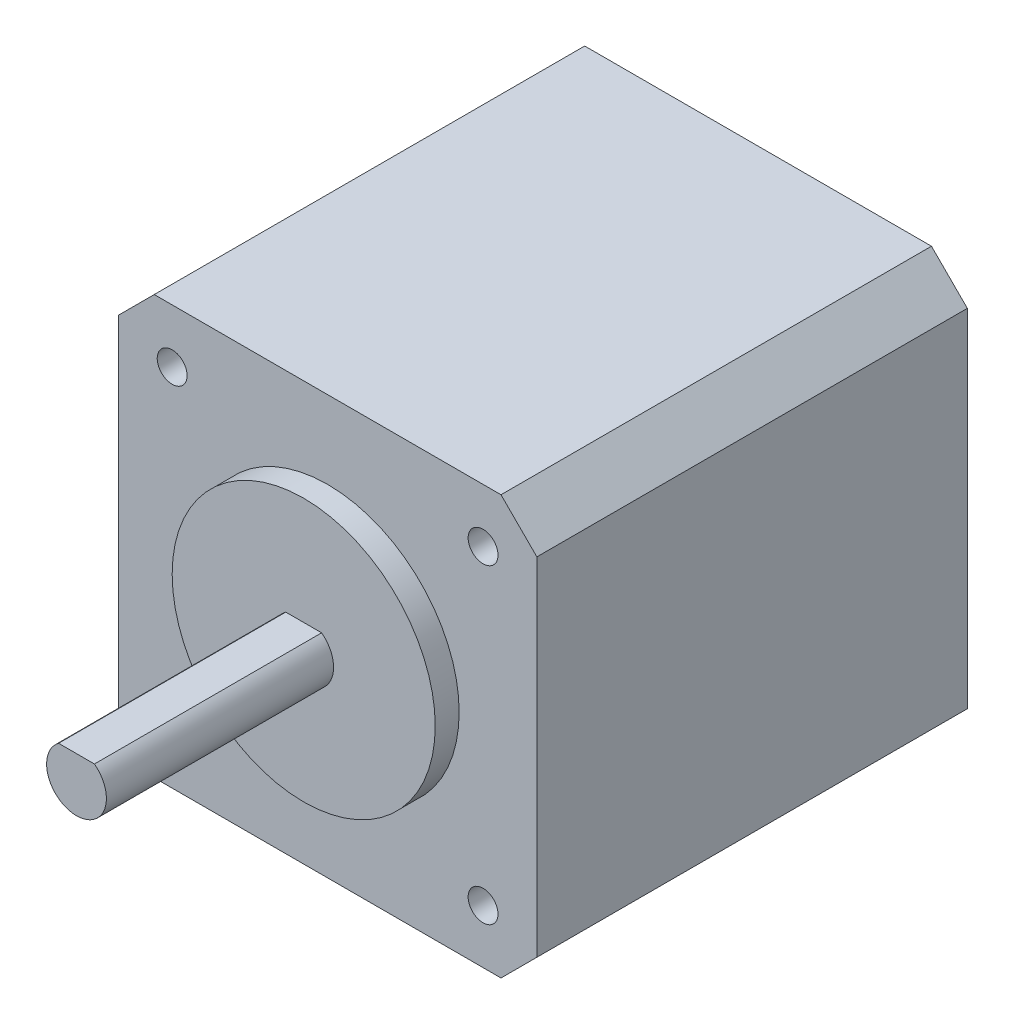
ISO-10303-21;
HEADER;
FILE_DESCRIPTION(('STEP AP214'),'2;1');
FILE_NAME('part.step','',(''),(''),'','','');
FILE_SCHEMA(('AUTOMOTIVE_DESIGN { 1 0 10303 214 1 1 1 1 }'));
ENDSEC;
DATA;
#1=APPLICATION_CONTEXT('core data for automotive mechanical design processes');
#2=APPLICATION_PROTOCOL_DEFINITION('international standard','automotive_design',2000,#1);
#3=PRODUCT_CONTEXT('',#1,'mechanical');
#4=PRODUCT('Part','Part','',(#3));
#5=PRODUCT_RELATED_PRODUCT_CATEGORY('part','',(#4));
#6=PRODUCT_DEFINITION_FORMATION('','',#4);
#7=PRODUCT_DEFINITION_CONTEXT('part definition',#1,'design');
#8=PRODUCT_DEFINITION('design','',#6,#7);
#9=PRODUCT_DEFINITION_SHAPE('','',#8);
#10=(LENGTH_UNIT() NAMED_UNIT(*) SI_UNIT(.MILLI.,.METRE.));
#11=(NAMED_UNIT(*) PLANE_ANGLE_UNIT() SI_UNIT($,.RADIAN.));
#12=(NAMED_UNIT(*) SI_UNIT($,.STERADIAN.) SOLID_ANGLE_UNIT());
#13=UNCERTAINTY_MEASURE_WITH_UNIT(LENGTH_MEASURE(1.E-05),#10,'distance_accuracy_value','');
#14=(GEOMETRIC_REPRESENTATION_CONTEXT(3) GLOBAL_UNCERTAINTY_ASSIGNED_CONTEXT((#13)) GLOBAL_UNIT_ASSIGNED_CONTEXT((#10,
#11,#12)) REPRESENTATION_CONTEXT('',''));
#15=CARTESIAN_POINT('',(0.,0.,0.));
#16=DIRECTION('',(0.,0.,1.));
#17=DIRECTION('',(1.,0.,0.));
#18=AXIS2_PLACEMENT_3D('',#15,#16,#17);
#19=CARTESIAN_POINT('',(0.,0.,0.));
#20=DIRECTION('',(0.,0.,1.));
#21=DIRECTION('',(1.,0.,0.));
#22=AXIS2_PLACEMENT_3D('',#19,#20,#21);
#23=PLANE('',#22);
#24=CARTESIAN_POINT('',(13.,13.,0.));
#25=DIRECTION('',(0.,0.,1.));
#26=DIRECTION('',(1.,0.,0.));
#27=AXIS2_PLACEMENT_3D('',#24,#25,#26);
#28=CIRCLE('',#27,1.25);
#29=CARTESIAN_POINT('',(14.25,13.,0.));
#30=VERTEX_POINT('',#29);
#31=EDGE_CURVE('E203',#30,#30,#28,.T.);
#32=ORIENTED_EDGE('',*,*,#31,.F.);
#33=EDGE_LOOP('',(#32));
#34=FACE_BOUND('',#33,.T.);
#35=CARTESIAN_POINT('',(-13.,13.,0.));
#36=DIRECTION('',(0.,0.,1.));
#37=DIRECTION('',(1.,0.,0.));
#38=AXIS2_PLACEMENT_3D('',#35,#36,#37);
#39=CIRCLE('',#38,1.25);
#40=CARTESIAN_POINT('',(-11.75,13.,0.));
#41=VERTEX_POINT('',#40);
#42=EDGE_CURVE('E214',#41,#41,#39,.T.);
#43=ORIENTED_EDGE('',*,*,#42,.F.);
#44=EDGE_LOOP('',(#43));
#45=FACE_BOUND('',#44,.T.);
#46=CARTESIAN_POINT('',(-13.,-13.,0.));
#47=DIRECTION('',(0.,0.,1.));
#48=DIRECTION('',(1.,0.,0.));
#49=AXIS2_PLACEMENT_3D('',#46,#47,#48);
#50=CIRCLE('',#49,1.25);
#51=CARTESIAN_POINT('',(-11.75,-13.,0.));
#52=VERTEX_POINT('',#51);
#53=EDGE_CURVE('E220',#52,#52,#50,.T.);
#54=ORIENTED_EDGE('',*,*,#53,.F.);
#55=EDGE_LOOP('',(#54));
#56=FACE_BOUND('',#55,.T.);
#57=CARTESIAN_POINT('',(13.,-13.,0.));
#58=DIRECTION('',(0.,0.,1.));
#59=DIRECTION('',(1.,0.,0.));
#60=AXIS2_PLACEMENT_3D('',#57,#58,#59);
#61=CIRCLE('',#60,1.25);
#62=CARTESIAN_POINT('',(14.25,-13.,0.));
#63=VERTEX_POINT('',#62);
#64=EDGE_CURVE('E226',#63,#63,#61,.T.);
#65=ORIENTED_EDGE('',*,*,#64,.F.);
#66=EDGE_LOOP('',(#65));
#67=FACE_BOUND('',#66,.T.);
#68=DIRECTION('',(-0.707106781186548,0.707106781186547,0.));
#69=VECTOR('',#68,1.);
#70=CARTESIAN_POINT('',(17.5,14.5,0.));
#71=LINE('',#70,#69);
#72=CARTESIAN_POINT('',(17.5,14.5,0.));
#73=VERTEX_POINT('',#72);
#74=CARTESIAN_POINT('',(14.5,17.5,0.));
#75=VERTEX_POINT('',#74);
#76=EDGE_CURVE('E151',#73,#75,#71,.T.);
#77=ORIENTED_EDGE('',*,*,#76,.T.);
#78=DIRECTION('',(-1.,0.,0.));
#79=VECTOR('',#78,1.);
#80=CARTESIAN_POINT('',(14.5,17.5,0.));
#81=LINE('',#80,#79);
#82=CARTESIAN_POINT('',(-14.5,17.5,0.));
#83=VERTEX_POINT('',#82);
#84=EDGE_CURVE('E154',#75,#83,#81,.T.);
#85=ORIENTED_EDGE('',*,*,#84,.T.);
#86=DIRECTION('',(-0.707106781186547,-0.707106781186548,0.));
#87=VECTOR('',#86,1.);
#88=CARTESIAN_POINT('',(-14.5,17.5,0.));
#89=LINE('',#88,#87);
#90=CARTESIAN_POINT('',(-17.5,14.5,0.));
#91=VERTEX_POINT('',#90);
#92=EDGE_CURVE('E158',#83,#91,#89,.T.);
#93=ORIENTED_EDGE('',*,*,#92,.T.);
#94=DIRECTION('',(0.,1.,0.));
#95=VECTOR('',#94,1.);
#96=CARTESIAN_POINT('',(-17.5,-14.5,0.));
#97=LINE('',#96,#95);
#98=CARTESIAN_POINT('',(-17.5,-14.5,0.));
#99=VERTEX_POINT('',#98);
#100=EDGE_CURVE('E161',#99,#91,#97,.T.);
#101=ORIENTED_EDGE('',*,*,#100,.F.);
#102=DIRECTION('',(-0.707106781186548,0.707106781186547,0.));
#103=VECTOR('',#102,1.);
#104=CARTESIAN_POINT('',(-14.5,-17.5,0.));
#105=LINE('',#104,#103);
#106=CARTESIAN_POINT('',(-14.5,-17.5,0.));
#107=VERTEX_POINT('',#106);
#108=EDGE_CURVE('E164',#107,#99,#105,.T.);
#109=ORIENTED_EDGE('',*,*,#108,.F.);
#110=DIRECTION('',(-1.,0.,0.));
#111=VECTOR('',#110,1.);
#112=CARTESIAN_POINT('',(14.5,-17.5,0.));
#113=LINE('',#112,#111);
#114=CARTESIAN_POINT('',(14.5,-17.5,0.));
#115=VERTEX_POINT('',#114);
#116=EDGE_CURVE('E166',#115,#107,#113,.T.);
#117=ORIENTED_EDGE('',*,*,#116,.F.);
#118=DIRECTION('',(-0.707106781186548,-0.707106781186547,0.));
#119=VECTOR('',#118,1.);
#120=CARTESIAN_POINT('',(17.5,-14.5,0.));
#121=LINE('',#120,#119);
#122=CARTESIAN_POINT('',(17.5,-14.5,0.));
#123=VERTEX_POINT('',#122);
#124=EDGE_CURVE('E135',#123,#115,#121,.T.);
#125=ORIENTED_EDGE('',*,*,#124,.F.);
#126=DIRECTION('',(0.,1.,0.));
#127=VECTOR('',#126,1.);
#128=CARTESIAN_POINT('',(17.5,-14.5,0.));
#129=LINE('',#128,#127);
#130=EDGE_CURVE('E169',#123,#73,#129,.T.);
#131=ORIENTED_EDGE('',*,*,#130,.T.);
#132=EDGE_LOOP('',(#77,#85,#93,#101,#109,#117,#125,#131));
#133=FACE_BOUND('',#132,.T.);
#134=CARTESIAN_POINT('',(0.,0.,0.));
#135=DIRECTION('',(0.,0.,1.));
#136=DIRECTION('',(1.,0.,0.));
#137=AXIS2_PLACEMENT_3D('',#134,#135,#136);
#138=CIRCLE('',#137,11.);
#139=CARTESIAN_POINT('',(11.,0.,0.));
#140=VERTEX_POINT('',#139);
#141=EDGE_CURVE('E232',#140,#140,#138,.T.);
#142=ORIENTED_EDGE('',*,*,#141,.F.);
#143=EDGE_LOOP('',(#142));
#144=FACE_BOUND('',#143,.T.);
#145=ADVANCED_FACE('F41',(#34,#45,#56,#67,#133,#144),#23,.T.);
#146=CARTESIAN_POINT('',(17.5,14.5,-36.));
#147=DIRECTION('',(0.707106781186547,0.707106781186548,0.));
#148=DIRECTION('',(-0.707106781186548,0.707106781186547,0.));
#149=AXIS2_PLACEMENT_3D('',#146,#147,#148);
#150=PLANE('',#149);
#151=ORIENTED_EDGE('',*,*,#76,.F.);
#152=DIRECTION('',(0.,0.,1.));
#153=VECTOR('',#152,1.);
#154=CARTESIAN_POINT('',(17.5,14.5,-36.));
#155=LINE('',#154,#153);
#156=CARTESIAN_POINT('',(17.5,14.5,-36.));
#157=VERTEX_POINT('',#156);
#158=EDGE_CURVE('E64',#157,#73,#155,.T.);
#159=ORIENTED_EDGE('',*,*,#158,.F.);
#160=DIRECTION('',(-0.707106781186548,0.707106781186547,0.));
#161=VECTOR('',#160,1.);
#162=CARTESIAN_POINT('',(17.5,14.5,-36.));
#163=LINE('',#162,#161);
#164=CARTESIAN_POINT('',(14.5,17.5,-36.));
#165=VERTEX_POINT('',#164);
#166=EDGE_CURVE('E172',#157,#165,#163,.T.);
#167=ORIENTED_EDGE('',*,*,#166,.T.);
#168=DIRECTION('',(0.,0.,1.));
#169=VECTOR('',#168,1.);
#170=CARTESIAN_POINT('',(14.5,17.5,-36.));
#171=LINE('',#170,#169);
#172=EDGE_CURVE('E103',#165,#75,#171,.T.);
#173=ORIENTED_EDGE('',*,*,#172,.T.);
#174=EDGE_LOOP('',(#151,#159,#167,#173));
#175=FACE_BOUND('',#174,.T.);
#176=ADVANCED_FACE('F43',(#175),#150,.T.);
#177=CARTESIAN_POINT('',(17.5,-14.5,-36.));
#178=DIRECTION('',(1.,0.,0.));
#179=DIRECTION('',(0.,0.,-1.));
#180=AXIS2_PLACEMENT_3D('',#177,#178,#179);
#181=PLANE('',#180);
#182=ORIENTED_EDGE('',*,*,#130,.F.);
#183=DIRECTION('',(0.,0.,1.));
#184=VECTOR('',#183,1.);
#185=CARTESIAN_POINT('',(17.5,-14.5,-36.));
#186=LINE('',#185,#184);
#187=CARTESIAN_POINT('',(17.5,-14.5,-36.));
#188=VERTEX_POINT('',#187);
#189=EDGE_CURVE('E138',#188,#123,#186,.T.);
#190=ORIENTED_EDGE('',*,*,#189,.F.);
#191=DIRECTION('',(0.,1.,0.));
#192=VECTOR('',#191,1.);
#193=CARTESIAN_POINT('',(17.5,-14.5,-36.));
#194=LINE('',#193,#192);
#195=EDGE_CURVE('E128',#188,#157,#194,.T.);
#196=ORIENTED_EDGE('',*,*,#195,.T.);
#197=ORIENTED_EDGE('',*,*,#158,.T.);
#198=EDGE_LOOP('',(#182,#190,#196,#197));
#199=FACE_BOUND('',#198,.T.);
#200=ADVANCED_FACE('F255',(#199),#181,.T.);
#201=CARTESIAN_POINT('',(17.5,-14.5,-36.));
#202=DIRECTION('',(-0.707106781186547,0.707106781186548,0.));
#203=DIRECTION('',(-0.707106781186548,-0.707106781186547,0.));
#204=AXIS2_PLACEMENT_3D('',#201,#202,#203);
#205=PLANE('',#204);
#206=ORIENTED_EDGE('',*,*,#124,.T.);
#207=DIRECTION('',(0.,0.,1.));
#208=VECTOR('',#207,1.);
#209=CARTESIAN_POINT('',(14.5,-17.5,-36.));
#210=LINE('',#209,#208);
#211=CARTESIAN_POINT('',(14.5,-17.5,-36.));
#212=VERTEX_POINT('',#211);
#213=EDGE_CURVE('E132',#212,#115,#210,.T.);
#214=ORIENTED_EDGE('',*,*,#213,.F.);
#215=DIRECTION('',(-0.707106781186548,-0.707106781186547,0.));
#216=VECTOR('',#215,1.);
#217=CARTESIAN_POINT('',(17.5,-14.5,-36.));
#218=LINE('',#217,#216);
#219=EDGE_CURVE('E122',#188,#212,#218,.T.);
#220=ORIENTED_EDGE('',*,*,#219,.F.);
#221=ORIENTED_EDGE('',*,*,#189,.T.);
#222=EDGE_LOOP('',(#206,#214,#220,#221));
#223=FACE_BOUND('',#222,.T.);
#224=ADVANCED_FACE('F133',(#223),#205,.F.);
#225=CARTESIAN_POINT('',(14.5,-17.5,-36.));
#226=DIRECTION('',(0.,1.,0.));
#227=DIRECTION('',(-1.,0.,0.));
#228=AXIS2_PLACEMENT_3D('',#225,#226,#227);
#229=PLANE('',#228);
#230=ORIENTED_EDGE('',*,*,#116,.T.);
#231=DIRECTION('',(0.,0.,1.));
#232=VECTOR('',#231,1.);
#233=CARTESIAN_POINT('',(-14.5,-17.5,-36.));
#234=LINE('',#233,#232);
#235=CARTESIAN_POINT('',(-14.5,-17.5,-36.));
#236=VERTEX_POINT('',#235);
#237=EDGE_CURVE('E139',#236,#107,#234,.T.);
#238=ORIENTED_EDGE('',*,*,#237,.F.);
#239=DIRECTION('',(-1.,0.,0.));
#240=VECTOR('',#239,1.);
#241=CARTESIAN_POINT('',(14.5,-17.5,-36.));
#242=LINE('',#241,#240);
#243=EDGE_CURVE('E126',#212,#236,#242,.T.);
#244=ORIENTED_EDGE('',*,*,#243,.F.);
#245=ORIENTED_EDGE('',*,*,#213,.T.);
#246=EDGE_LOOP('',(#230,#238,#244,#245));
#247=FACE_BOUND('',#246,.T.);
#248=ADVANCED_FACE('F141',(#247),#229,.F.);
#249=CARTESIAN_POINT('',(-14.5,-17.5,-36.));
#250=DIRECTION('',(0.707106781186547,0.707106781186548,0.));
#251=DIRECTION('',(-0.707106781186548,0.707106781186547,0.));
#252=AXIS2_PLACEMENT_3D('',#249,#250,#251);
#253=PLANE('',#252);
#254=ORIENTED_EDGE('',*,*,#108,.T.);
#255=DIRECTION('',(0.,0.,1.));
#256=VECTOR('',#255,1.);
#257=CARTESIAN_POINT('',(-17.5,-14.5,-36.));
#258=LINE('',#257,#256);
#259=CARTESIAN_POINT('',(-17.5,-14.5,-36.));
#260=VERTEX_POINT('',#259);
#261=EDGE_CURVE('E176',#260,#99,#258,.T.);
#262=ORIENTED_EDGE('',*,*,#261,.F.);
#263=DIRECTION('',(-0.707106781186548,0.707106781186547,0.));
#264=VECTOR('',#263,1.);
#265=CARTESIAN_POINT('',(-14.5,-17.5,-36.));
#266=LINE('',#265,#264);
#267=EDGE_CURVE('E144',#236,#260,#266,.T.);
#268=ORIENTED_EDGE('',*,*,#267,.F.);
#269=ORIENTED_EDGE('',*,*,#237,.T.);
#270=EDGE_LOOP('',(#254,#262,#268,#269));
#271=FACE_BOUND('',#270,.T.);
#272=ADVANCED_FACE('F421',(#271),#253,.F.);
#273=CARTESIAN_POINT('',(-17.5,-14.5,-36.));
#274=DIRECTION('',(1.,0.,0.));
#275=DIRECTION('',(0.,1.,0.));
#276=AXIS2_PLACEMENT_3D('',#273,#274,#275);
#277=PLANE('',#276);
#278=ORIENTED_EDGE('',*,*,#100,.T.);
#279=DIRECTION('',(0.,0.,1.));
#280=VECTOR('',#279,1.);
#281=CARTESIAN_POINT('',(-17.5,14.5,-36.));
#282=LINE('',#281,#280);
#283=CARTESIAN_POINT('',(-17.5,14.5,-36.));
#284=VERTEX_POINT('',#283);
#285=EDGE_CURVE('E179',#284,#91,#282,.T.);
#286=ORIENTED_EDGE('',*,*,#285,.F.);
#287=DIRECTION('',(0.,1.,0.));
#288=VECTOR('',#287,1.);
#289=CARTESIAN_POINT('',(-17.5,-14.5,-36.));
#290=LINE('',#289,#288);
#291=EDGE_CURVE('E146',#260,#284,#290,.T.);
#292=ORIENTED_EDGE('',*,*,#291,.F.);
#293=ORIENTED_EDGE('',*,*,#261,.T.);
#294=EDGE_LOOP('',(#278,#286,#292,#293));
#295=FACE_BOUND('',#294,.T.);
#296=ADVANCED_FACE('F247',(#295),#277,.F.);
#297=CARTESIAN_POINT('',(-14.5,17.5,-36.));
#298=DIRECTION('',(-0.707106781186548,0.707106781186547,0.));
#299=DIRECTION('',(-0.707106781186547,-0.707106781186548,0.));
#300=AXIS2_PLACEMENT_3D('',#297,#298,#299);
#301=PLANE('',#300);
#302=ORIENTED_EDGE('',*,*,#92,.F.);
#303=DIRECTION('',(0.,0.,1.));
#304=VECTOR('',#303,1.);
#305=CARTESIAN_POINT('',(-14.5,17.5,-36.));
#306=LINE('',#305,#304);
#307=CARTESIAN_POINT('',(-14.5,17.5,-36.));
#308=VERTEX_POINT('',#307);
#309=EDGE_CURVE('E181',#308,#83,#306,.T.);
#310=ORIENTED_EDGE('',*,*,#309,.F.);
#311=DIRECTION('',(-0.707106781186547,-0.707106781186548,0.));
#312=VECTOR('',#311,1.);
#313=CARTESIAN_POINT('',(-14.5,17.5,-36.));
#314=LINE('',#313,#312);
#315=EDGE_CURVE('E240',#308,#284,#314,.T.);
#316=ORIENTED_EDGE('',*,*,#315,.T.);
#317=ORIENTED_EDGE('',*,*,#285,.T.);
#318=EDGE_LOOP('',(#302,#310,#316,#317));
#319=FACE_BOUND('',#318,.T.);
#320=ADVANCED_FACE('F251',(#319),#301,.T.);
#321=CARTESIAN_POINT('',(14.5,17.5,-36.));
#322=DIRECTION('',(0.,1.,0.));
#323=DIRECTION('',(-1.,0.,0.));
#324=AXIS2_PLACEMENT_3D('',#321,#322,#323);
#325=PLANE('',#324);
#326=ORIENTED_EDGE('',*,*,#84,.F.);
#327=ORIENTED_EDGE('',*,*,#172,.F.);
#328=DIRECTION('',(-1.,0.,0.));
#329=VECTOR('',#328,1.);
#330=CARTESIAN_POINT('',(14.5,17.5,-36.));
#331=LINE('',#330,#329);
#332=EDGE_CURVE('E238',#165,#308,#331,.T.);
#333=ORIENTED_EDGE('',*,*,#332,.T.);
#334=ORIENTED_EDGE('',*,*,#309,.T.);
#335=EDGE_LOOP('',(#326,#327,#333,#334));
#336=FACE_BOUND('',#335,.T.);
#337=ADVANCED_FACE('F252',(#336),#325,.T.);
#338=CARTESIAN_POINT('',(0.,0.,-36.));
#339=DIRECTION('',(0.,0.,1.));
#340=DIRECTION('',(1.,0.,0.));
#341=AXIS2_PLACEMENT_3D('',#338,#339,#340);
#342=PLANE('',#341);
#343=ORIENTED_EDGE('',*,*,#166,.F.);
#344=ORIENTED_EDGE('',*,*,#195,.F.);
#345=ORIENTED_EDGE('',*,*,#219,.T.);
#346=ORIENTED_EDGE('',*,*,#243,.T.);
#347=ORIENTED_EDGE('',*,*,#267,.T.);
#348=ORIENTED_EDGE('',*,*,#291,.T.);
#349=ORIENTED_EDGE('',*,*,#315,.F.);
#350=ORIENTED_EDGE('',*,*,#332,.F.);
#351=EDGE_LOOP('',(#343,#344,#345,#346,#347,#348,#349,#350));
#352=FACE_BOUND('',#351,.T.);
#353=ADVANCED_FACE('F124',(#352),#342,.F.);
#354=CARTESIAN_POINT('',(0.,0.,2.));
#355=DIRECTION('',(0.,0.,-1.));
#356=DIRECTION('',(-1.,0.,0.));
#357=AXIS2_PLACEMENT_3D('',#354,#355,#356);
#358=CYLINDRICAL_SURFACE('',#357,11.);
#359=CARTESIAN_POINT('',(0.,0.,2.));
#360=DIRECTION('',(0.,0.,1.));
#361=DIRECTION('',(1.,0.,0.));
#362=AXIS2_PLACEMENT_3D('',#359,#360,#361);
#363=CIRCLE('',#362,11.);
#364=CARTESIAN_POINT('',(11.,0.,2.));
#365=VERTEX_POINT('',#364);
#366=EDGE_CURVE('E155',#365,#365,#363,.T.);
#367=ORIENTED_EDGE('',*,*,#366,.F.);
#368=EDGE_LOOP('',(#367));
#369=FACE_BOUND('',#368,.T.);
#370=ORIENTED_EDGE('',*,*,#141,.T.);
#371=EDGE_LOOP('',(#370));
#372=FACE_BOUND('',#371,.T.);
#373=ADVANCED_FACE('F273',(#369,#372),#358,.T.);
#374=CARTESIAN_POINT('',(0.,0.,2.));
#375=DIRECTION('',(0.,0.,1.));
#376=DIRECTION('',(1.,0.,0.));
#377=AXIS2_PLACEMENT_3D('',#374,#375,#376);
#378=PLANE('',#377);
#379=DIRECTION('',(-1.,0.,0.));
#380=VECTOR('',#379,1.);
#381=CARTESIAN_POINT('',(0.,2.00000000000001,2.));
#382=LINE('',#381,#380);
#383=CARTESIAN_POINT('',(1.5,2.00000000000001,2.00000000000001));
#384=VERTEX_POINT('',#383);
#385=CARTESIAN_POINT('',(-1.5,2.00000000000001,2.));
#386=VERTEX_POINT('',#385);
#387=EDGE_CURVE('E11',#384,#386,#382,.T.);
#388=ORIENTED_EDGE('',*,*,#387,.F.);
#389=CARTESIAN_POINT('',(0.,0.,2.));
#390=DIRECTION('',(0.,0.,1.));
#391=DIRECTION('',(1.,0.,0.));
#392=AXIS2_PLACEMENT_3D('',#389,#390,#391);
#393=CIRCLE('',#392,2.5);
#394=EDGE_CURVE('E49',#384,#386,#393,.F.);
#395=ORIENTED_EDGE('',*,*,#394,.T.);
#396=EDGE_LOOP('',(#388,#395));
#397=FACE_BOUND('',#396,.T.);
#398=ORIENTED_EDGE('',*,*,#366,.T.);
#399=EDGE_LOOP('',(#398));
#400=FACE_BOUND('',#399,.T.);
#401=ADVANCED_FACE('F186',(#397,#400),#378,.T.);
#402=CARTESIAN_POINT('',(13.,-13.,-5.));
#403=DIRECTION('',(0.,0.,1.));
#404=DIRECTION('',(1.,0.,0.));
#405=AXIS2_PLACEMENT_3D('',#402,#403,#404);
#406=CONICAL_SURFACE('',#405,1.25,1.02974425867665);
#407=CARTESIAN_POINT('',(13.,-13.,-5.75107577378445));
#408=VERTEX_POINT('',#407);
#409=VERTEX_LOOP('',#408);
#410=FACE_BOUND('',#409,.T.);
#411=CARTESIAN_POINT('',(13.,-13.,-5.));
#412=DIRECTION('',(0.,0.,1.));
#413=DIRECTION('',(1.,0.,0.));
#414=AXIS2_PLACEMENT_3D('',#411,#412,#413);
#415=CIRCLE('',#414,1.25);
#416=CARTESIAN_POINT('',(14.25,-13.,-5.));
#417=VERTEX_POINT('',#416);
#418=EDGE_CURVE('E229',#417,#417,#415,.T.);
#419=ORIENTED_EDGE('',*,*,#418,.T.);
#420=EDGE_LOOP('',(#419));
#421=FACE_BOUND('',#420,.T.);
#422=ADVANCED_FACE('F279',(#410,#421),#406,.F.);
#423=CARTESIAN_POINT('',(13.,-13.,0.));
#424=DIRECTION('',(0.,0.,1.));
#425=DIRECTION('',(1.,0.,0.));
#426=AXIS2_PLACEMENT_3D('',#423,#424,#425);
#427=CYLINDRICAL_SURFACE('',#426,1.25);
#428=ORIENTED_EDGE('',*,*,#418,.F.);
#429=EDGE_LOOP('',(#428));
#430=FACE_BOUND('',#429,.T.);
#431=ORIENTED_EDGE('',*,*,#64,.T.);
#432=EDGE_LOOP('',(#431));
#433=FACE_BOUND('',#432,.T.);
#434=ADVANCED_FACE('F282',(#430,#433),#427,.F.);
#435=CARTESIAN_POINT('',(-13.,-13.,-5.));
#436=DIRECTION('',(0.,0.,1.));
#437=DIRECTION('',(1.,0.,0.));
#438=AXIS2_PLACEMENT_3D('',#435,#436,#437);
#439=CONICAL_SURFACE('',#438,1.25,1.02974425867665);
#440=CARTESIAN_POINT('',(-13.,-13.,-5.75107577378445));
#441=VERTEX_POINT('',#440);
#442=VERTEX_LOOP('',#441);
#443=FACE_BOUND('',#442,.T.);
#444=CARTESIAN_POINT('',(-13.,-13.,-5.));
#445=DIRECTION('',(0.,0.,1.));
#446=DIRECTION('',(1.,0.,0.));
#447=AXIS2_PLACEMENT_3D('',#444,#445,#446);
#448=CIRCLE('',#447,1.25);
#449=CARTESIAN_POINT('',(-11.75,-13.,-5.));
#450=VERTEX_POINT('',#449);
#451=EDGE_CURVE('E223',#450,#450,#448,.T.);
#452=ORIENTED_EDGE('',*,*,#451,.T.);
#453=EDGE_LOOP('',(#452));
#454=FACE_BOUND('',#453,.T.);
#455=ADVANCED_FACE('F286',(#443,#454),#439,.F.);
#456=CARTESIAN_POINT('',(-13.,-13.,0.));
#457=DIRECTION('',(0.,0.,1.));
#458=DIRECTION('',(1.,0.,0.));
#459=AXIS2_PLACEMENT_3D('',#456,#457,#458);
#460=CYLINDRICAL_SURFACE('',#459,1.25);
#461=ORIENTED_EDGE('',*,*,#451,.F.);
#462=EDGE_LOOP('',(#461));
#463=FACE_BOUND('',#462,.T.);
#464=ORIENTED_EDGE('',*,*,#53,.T.);
#465=EDGE_LOOP('',(#464));
#466=FACE_BOUND('',#465,.T.);
#467=ADVANCED_FACE('F290',(#463,#466),#460,.F.);
#468=CARTESIAN_POINT('',(-13.,13.,-5.));
#469=DIRECTION('',(0.,0.,1.));
#470=DIRECTION('',(1.,0.,0.));
#471=AXIS2_PLACEMENT_3D('',#468,#469,#470);
#472=CONICAL_SURFACE('',#471,1.25,1.02974425867665);
#473=CARTESIAN_POINT('',(-13.,13.,-5.75107577378445));
#474=VERTEX_POINT('',#473);
#475=VERTEX_LOOP('',#474);
#476=FACE_BOUND('',#475,.T.);
#477=CARTESIAN_POINT('',(-13.,13.,-5.));
#478=DIRECTION('',(0.,0.,1.));
#479=DIRECTION('',(1.,0.,0.));
#480=AXIS2_PLACEMENT_3D('',#477,#478,#479);
#481=CIRCLE('',#480,1.25);
#482=CARTESIAN_POINT('',(-11.75,13.,-5.));
#483=VERTEX_POINT('',#482);
#484=EDGE_CURVE('E217',#483,#483,#481,.T.);
#485=ORIENTED_EDGE('',*,*,#484,.T.);
#486=EDGE_LOOP('',(#485));
#487=FACE_BOUND('',#486,.T.);
#488=ADVANCED_FACE('F294',(#476,#487),#472,.F.);
#489=CARTESIAN_POINT('',(-13.,13.,0.));
#490=DIRECTION('',(0.,0.,1.));
#491=DIRECTION('',(1.,0.,0.));
#492=AXIS2_PLACEMENT_3D('',#489,#490,#491);
#493=CYLINDRICAL_SURFACE('',#492,1.25);
#494=ORIENTED_EDGE('',*,*,#484,.F.);
#495=EDGE_LOOP('',(#494));
#496=FACE_BOUND('',#495,.T.);
#497=ORIENTED_EDGE('',*,*,#42,.T.);
#498=EDGE_LOOP('',(#497));
#499=FACE_BOUND('',#498,.T.);
#500=ADVANCED_FACE('F298',(#496,#499),#493,.F.);
#501=CARTESIAN_POINT('',(13.,13.,-5.));
#502=DIRECTION('',(0.,0.,1.));
#503=DIRECTION('',(1.,0.,0.));
#504=AXIS2_PLACEMENT_3D('',#501,#502,#503);
#505=CONICAL_SURFACE('',#504,1.25,1.02974425867665);
#506=CARTESIAN_POINT('',(13.,13.,-5.75107577378445));
#507=VERTEX_POINT('',#506);
#508=VERTEX_LOOP('',#507);
#509=FACE_BOUND('',#508,.T.);
#510=CARTESIAN_POINT('',(13.,13.,-5.));
#511=DIRECTION('',(0.,0.,1.));
#512=DIRECTION('',(1.,0.,0.));
#513=AXIS2_PLACEMENT_3D('',#510,#511,#512);
#514=CIRCLE('',#513,1.25);
#515=CARTESIAN_POINT('',(14.25,13.,-5.));
#516=VERTEX_POINT('',#515);
#517=EDGE_CURVE('E211',#516,#516,#514,.T.);
#518=ORIENTED_EDGE('',*,*,#517,.T.);
#519=EDGE_LOOP('',(#518));
#520=FACE_BOUND('',#519,.T.);
#521=ADVANCED_FACE('F302',(#509,#520),#505,.F.);
#522=CARTESIAN_POINT('',(13.,13.,0.));
#523=DIRECTION('',(0.,0.,1.));
#524=DIRECTION('',(1.,0.,0.));
#525=AXIS2_PLACEMENT_3D('',#522,#523,#524);
#526=CYLINDRICAL_SURFACE('',#525,1.25);
#527=ORIENTED_EDGE('',*,*,#517,.F.);
#528=EDGE_LOOP('',(#527));
#529=FACE_BOUND('',#528,.T.);
#530=ORIENTED_EDGE('',*,*,#31,.T.);
#531=EDGE_LOOP('',(#530));
#532=FACE_BOUND('',#531,.T.);
#533=ADVANCED_FACE('F306',(#529,#532),#526,.F.);
#534=CARTESIAN_POINT('',(0.,2.00000000000001,21.));
#535=DIRECTION('',(0.,1.,0.));
#536=DIRECTION('',(-1.,0.,0.));
#537=AXIS2_PLACEMENT_3D('',#534,#535,#536);
#538=PLANE('',#537);
#539=DIRECTION('',(0.,0.,-1.));
#540=VECTOR('',#539,1.);
#541=CARTESIAN_POINT('',(1.5,2.00000000000001,21.));
#542=LINE('',#541,#540);
#543=CARTESIAN_POINT('',(1.5,2.00000000000001,21.));
#544=VERTEX_POINT('',#543);
#545=EDGE_CURVE('E193',#544,#384,#542,.T.);
#546=ORIENTED_EDGE('',*,*,#545,.T.);
#547=ORIENTED_EDGE('',*,*,#387,.T.);
#548=DIRECTION('',(0.,0.,-1.));
#549=VECTOR('',#548,1.);
#550=CARTESIAN_POINT('',(-1.5,2.00000000000001,21.));
#551=LINE('',#550,#549);
#552=CARTESIAN_POINT('',(-1.5,2.00000000000001,21.));
#553=VERTEX_POINT('',#552);
#554=EDGE_CURVE('E56',#553,#386,#551,.T.);
#555=ORIENTED_EDGE('',*,*,#554,.F.);
#556=DIRECTION('',(1.,0.,0.));
#557=VECTOR('',#556,1.);
#558=CARTESIAN_POINT('',(0.,2.00000000000001,21.));
#559=LINE('',#558,#557);
#560=EDGE_CURVE('E200',#553,#544,#559,.T.);
#561=ORIENTED_EDGE('',*,*,#560,.T.);
#562=EDGE_LOOP('',(#546,#547,#555,#561));
#563=FACE_BOUND('',#562,.T.);
#564=ADVANCED_FACE('F198',(#563),#538,.T.);
#565=CARTESIAN_POINT('',(0.,0.,21.));
#566=DIRECTION('',(0.,0.,-1.));
#567=DIRECTION('',(-1.,0.,0.));
#568=AXIS2_PLACEMENT_3D('',#565,#566,#567);
#569=CYLINDRICAL_SURFACE('',#568,2.5);
#570=ORIENTED_EDGE('',*,*,#394,.F.);
#571=ORIENTED_EDGE('',*,*,#545,.F.);
#572=CARTESIAN_POINT('',(0.,0.,21.));
#573=DIRECTION('',(0.,0.,1.));
#574=DIRECTION('',(1.,0.,0.));
#575=AXIS2_PLACEMENT_3D('',#572,#573,#574);
#576=CIRCLE('',#575,2.5);
#577=EDGE_CURVE('E201',#553,#544,#576,.T.);
#578=ORIENTED_EDGE('',*,*,#577,.F.);
#579=ORIENTED_EDGE('',*,*,#554,.T.);
#580=EDGE_LOOP('',(#570,#571,#578,#579));
#581=FACE_BOUND('',#580,.T.);
#582=ADVANCED_FACE('F191',(#581),#569,.T.);
#583=CARTESIAN_POINT('',(0.,0.,21.));
#584=DIRECTION('',(0.,0.,1.));
#585=DIRECTION('',(1.,0.,0.));
#586=AXIS2_PLACEMENT_3D('',#583,#584,#585);
#587=PLANE('',#586);
#588=ORIENTED_EDGE('',*,*,#560,.F.);
#589=ORIENTED_EDGE('',*,*,#577,.T.);
#590=EDGE_LOOP('',(#588,#589));
#591=FACE_BOUND('',#590,.T.);
#592=ADVANCED_FACE('F315',(#591),#587,.T.);
#593=CLOSED_SHELL('',(#145,#176,#200,#224,#248,#272,#296,#320,#337,#353,#373,#401,#422,#434,
#455,#467,#488,#500,#521,#533,#564,#582,#592));
#594=MANIFOLD_SOLID_BREP('B2',#593);
#595=ADVANCED_BREP_SHAPE_REPRESENTATION('',(#18,#594),#14);
#596=SHAPE_DEFINITION_REPRESENTATION(#9,#595);
ENDSEC;
END-ISO-10303-21;
